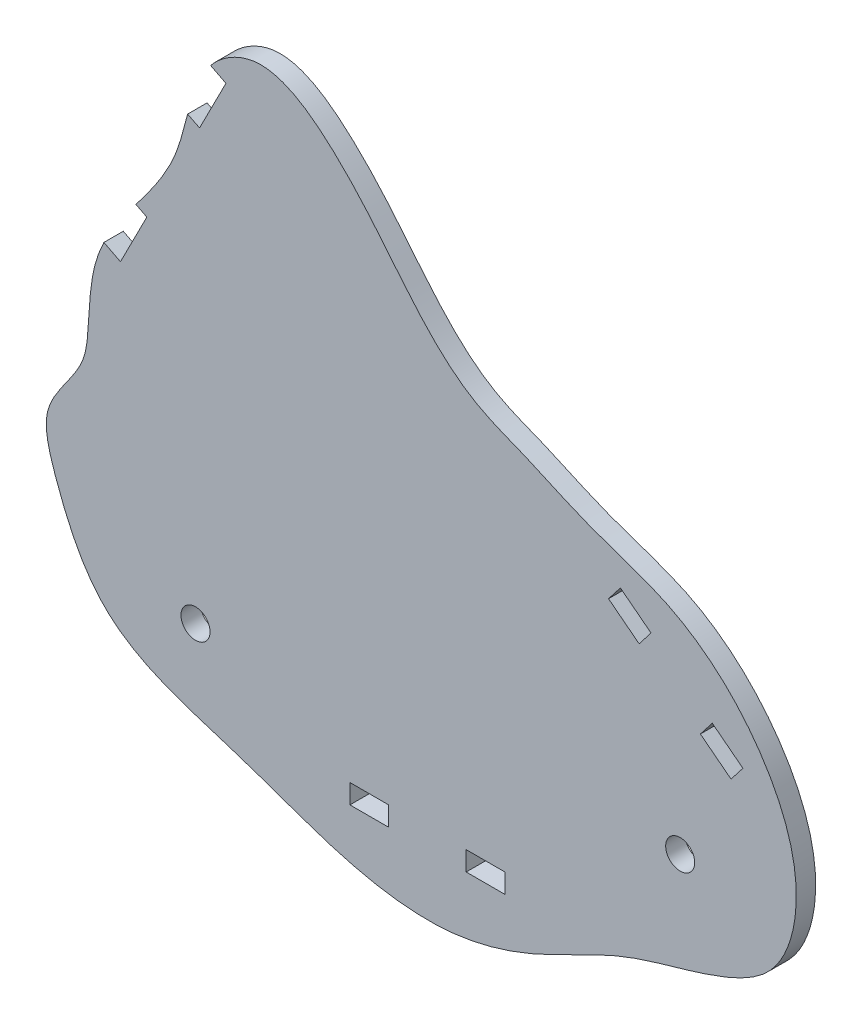
ISO-10303-21;
HEADER;
FILE_DESCRIPTION(('STEP AP214'),'2;1');
FILE_NAME('part.step','',(''),(''),'','','');
FILE_SCHEMA(('AUTOMOTIVE_DESIGN { 1 0 10303 214 1 1 1 1 }'));
ENDSEC;
DATA;
#1=APPLICATION_CONTEXT('core data for automotive mechanical design processes');
#2=APPLICATION_PROTOCOL_DEFINITION('international standard','automotive_design',2000,#1);
#3=PRODUCT_CONTEXT('',#1,'mechanical');
#4=PRODUCT('Part','Part','',(#3));
#5=PRODUCT_RELATED_PRODUCT_CATEGORY('part','',(#4));
#6=PRODUCT_DEFINITION_FORMATION('','',#4);
#7=PRODUCT_DEFINITION_CONTEXT('part definition',#1,'design');
#8=PRODUCT_DEFINITION('design','',#6,#7);
#9=PRODUCT_DEFINITION_SHAPE('','',#8);
#10=(LENGTH_UNIT() NAMED_UNIT(*) SI_UNIT(.MILLI.,.METRE.));
#11=(NAMED_UNIT(*) PLANE_ANGLE_UNIT() SI_UNIT($,.RADIAN.));
#12=(NAMED_UNIT(*) SI_UNIT($,.STERADIAN.) SOLID_ANGLE_UNIT());
#13=UNCERTAINTY_MEASURE_WITH_UNIT(LENGTH_MEASURE(1.E-05),#10,'distance_accuracy_value','');
#14=(GEOMETRIC_REPRESENTATION_CONTEXT(3) GLOBAL_UNCERTAINTY_ASSIGNED_CONTEXT((#13)) GLOBAL_UNIT_ASSIGNED_CONTEXT((#10,
#11,#12)) REPRESENTATION_CONTEXT('',''));
#15=CARTESIAN_POINT('',(0.,0.,0.));
#16=DIRECTION('',(0.,0.,1.));
#17=DIRECTION('',(1.,0.,0.));
#18=AXIS2_PLACEMENT_3D('',#15,#16,#17);
#19=CARTESIAN_POINT('',(103.338027454324,247.978514454164,5.82083802067196));
#20=DIRECTION('',(0.,0.,1.));
#21=DIRECTION('',(1.,0.,0.));
#22=AXIS2_PLACEMENT_3D('',#19,#20,#21);
#23=PLANE('',#22);
#24=CARTESIAN_POINT('',(120.991970876713,271.054419038319,5.82083802067196));
#25=DIRECTION('',(0.,0.,1.));
#26=DIRECTION('',(1.,0.,0.));
#27=AXIS2_PLACEMENT_3D('',#24,#25,#26);
#28=CIRCLE('',#27,2.38125000000001);
#29=CARTESIAN_POINT('',(123.373220876713,271.054419038319,5.82083802067196));
#30=VERTEX_POINT('',#29);
#31=EDGE_CURVE('E337',#30,#30,#28,.T.);
#32=ORIENTED_EDGE('',*,*,#31,.F.);
#33=EDGE_LOOP('',(#32));
#34=FACE_BOUND('',#33,.T.);
#35=CARTESIAN_POINT('',(41.5704047232676,264.101169083251,5.82083802067196));
#36=DIRECTION('',(0.,0.,1.));
#37=DIRECTION('',(1.,0.,0.));
#38=AXIS2_PLACEMENT_3D('',#35,#36,#37);
#39=CIRCLE('',#38,2.38125000000001);
#40=CARTESIAN_POINT('',(43.9516547232676,264.101169083251,5.82083802067196));
#41=VERTEX_POINT('',#40);
#42=EDGE_CURVE('E336',#41,#41,#39,.T.);
#43=ORIENTED_EDGE('',*,*,#42,.F.);
#44=EDGE_LOOP('',(#43));
#45=FACE_BOUND('',#44,.T.);
#46=DIRECTION('',(-0.790358439275779,0.612644707367618,0.));
#47=VECTOR('',#46,1.);
#48=CARTESIAN_POINT('',(131.452313127383,284.248089101087,5.82083802067196));
#49=LINE('',#48,#47);
#50=CARTESIAN_POINT('',(114.267499577497,297.56886173443,5.82083802067196));
#51=VERTEX_POINT('',#50);
#52=CARTESIAN_POINT('',(109.248723488096,301.459155626215,5.82083802067196));
#53=VERTEX_POINT('',#52);
#54=EDGE_CURVE('E325',#51,#53,#49,.T.);
#55=ORIENTED_EDGE('',*,*,#54,.T.);
#56=DIRECTION('',(0.612644707367617,0.79035843927578,0.));
#57=VECTOR('',#56,1.);
#58=CARTESIAN_POINT('',(81.1344378150372,265.189580979292,5.82083802067196));
#59=LINE('',#58,#57);
#60=CARTESIAN_POINT('',(111.193870433988,303.968543670915,5.82083802067196));
#61=VERTEX_POINT('',#60);
#62=EDGE_CURVE('E319',#53,#61,#59,.T.);
#63=ORIENTED_EDGE('',*,*,#62,.T.);
#64=DIRECTION('',(0.79035843927578,-0.612644707367617,0.));
#65=VECTOR('',#64,1.);
#66=CARTESIAN_POINT('',(133.397460073275,286.757477145787,5.82083802067196));
#67=LINE('',#66,#65);
#68=CARTESIAN_POINT('',(116.212646523389,300.078249779131,5.82083802067196));
#69=VERTEX_POINT('',#68);
#70=EDGE_CURVE('E332',#61,#69,#67,.T.);
#71=ORIENTED_EDGE('',*,*,#70,.T.);
#72=DIRECTION('',(-0.612644707367617,-0.79035843927578,0.));
#73=VECTOR('',#72,1.);
#74=CARTESIAN_POINT('',(86.1532139044383,261.299287087507,5.82083802067196));
#75=LINE('',#74,#73);
#76=EDGE_CURVE('E313',#69,#51,#75,.T.);
#77=ORIENTED_EDGE('',*,*,#76,.T.);
#78=EDGE_LOOP('',(#55,#63,#71,#77));
#79=FACE_BOUND('',#78,.T.);
#80=CARTESIAN_POINT('',(126.250198702192,292.297661995562,5.82083802067196));
#81=VERTEX_POINT('',#80);
#82=CARTESIAN_POINT('',(131.268974791593,288.407368103778,5.82083802067196));
#83=VERTEX_POINT('',#82);
#84=EDGE_CURVE('E329',#81,#83,#67,.T.);
#85=ORIENTED_EDGE('',*,*,#84,.T.);
#86=DIRECTION('',(-0.612644707367617,-0.79035843927578,0.));
#87=VECTOR('',#86,1.);
#88=CARTESIAN_POINT('',(101.209542172642,249.628405412154,5.82083802067196));
#89=LINE('',#88,#87);
#90=CARTESIAN_POINT('',(129.323827845701,285.897980059077,5.82083802067196));
#91=VERTEX_POINT('',#90);
#92=EDGE_CURVE('E322',#83,#91,#89,.T.);
#93=ORIENTED_EDGE('',*,*,#92,.T.);
#94=CARTESIAN_POINT('',(124.305051756299,289.788273950861,5.82083802067196));
#95=VERTEX_POINT('',#94);
#96=EDGE_CURVE('E328',#91,#95,#49,.T.);
#97=ORIENTED_EDGE('',*,*,#96,.T.);
#98=DIRECTION('',(0.612644707367617,0.79035843927578,0.));
#99=VECTOR('',#98,1.);
#100=CARTESIAN_POINT('',(96.1907660832408,253.518699303938,5.82083802067196));
#101=LINE('',#100,#99);
#102=EDGE_CURVE('E316',#95,#81,#101,.T.);
#103=ORIENTED_EDGE('',*,*,#102,.T.);
#104=EDGE_LOOP('',(#85,#93,#97,#103));
#105=FACE_BOUND('',#104,.T.);
#106=DIRECTION('',(-1.,0.,0.));
#107=VECTOR('',#106,1.);
#108=CARTESIAN_POINT('',(98.6231357055409,254.187588459737,5.82083802067194));
#109=LINE('',#108,#107);
#110=CARTESIAN_POINT('',(73.2231357055409,254.187588459737,5.82083802067193));
#111=VERTEX_POINT('',#110);
#112=CARTESIAN_POINT('',(66.8731357055409,254.187588459737,5.82083802067196));
#113=VERTEX_POINT('',#112);
#114=EDGE_CURVE('E274',#111,#113,#109,.T.);
#115=ORIENTED_EDGE('',*,*,#114,.F.);
#116=DIRECTION('',(0.,1.,0.));
#117=VECTOR('',#116,1.);
#118=CARTESIAN_POINT('',(73.2231357055409,251.012588459737,5.82083802067193));
#119=LINE('',#118,#117);
#120=CARTESIAN_POINT('',(73.2231357055409,251.012588459737,5.82083802067193));
#121=VERTEX_POINT('',#120);
#122=EDGE_CURVE('E258',#121,#111,#119,.T.);
#123=ORIENTED_EDGE('',*,*,#122,.F.);
#124=DIRECTION('',(-1.,0.,0.));
#125=VECTOR('',#124,1.);
#126=CARTESIAN_POINT('',(98.6231357055409,251.012588459737,5.82083802067194));
#127=LINE('',#126,#125);
#128=CARTESIAN_POINT('',(66.8731357055409,251.012588459737,5.82083802067193));
#129=VERTEX_POINT('',#128);
#130=EDGE_CURVE('E279',#121,#129,#127,.T.);
#131=ORIENTED_EDGE('',*,*,#130,.T.);
#132=DIRECTION('',(0.,1.,0.));
#133=VECTOR('',#132,1.);
#134=CARTESIAN_POINT('',(66.8731357055409,251.012588459737,5.82083802067193));
#135=LINE('',#134,#133);
#136=EDGE_CURVE('E247',#129,#113,#135,.T.);
#137=ORIENTED_EDGE('',*,*,#136,.T.);
#138=EDGE_LOOP('',(#115,#123,#131,#137));
#139=FACE_BOUND('',#138,.T.);
#140=CARTESIAN_POINT('',(92.2731357055409,254.187588459737,5.82083802067192));
#141=VERTEX_POINT('',#140);
#142=CARTESIAN_POINT('',(85.9231357055409,254.187588459737,5.82083802067196));
#143=VERTEX_POINT('',#142);
#144=EDGE_CURVE('E280',#141,#143,#109,.T.);
#145=ORIENTED_EDGE('',*,*,#144,.F.);
#146=DIRECTION('',(0.,1.,0.));
#147=VECTOR('',#146,1.);
#148=CARTESIAN_POINT('',(92.2731357055409,251.012588459737,5.82083802067192));
#149=LINE('',#148,#147);
#150=CARTESIAN_POINT('',(92.2731357055409,251.012588459737,5.82083802067192));
#151=VERTEX_POINT('',#150);
#152=EDGE_CURVE('E270',#151,#141,#149,.T.);
#153=ORIENTED_EDGE('',*,*,#152,.F.);
#154=CARTESIAN_POINT('',(85.9231357055409,251.012588459737,5.82083802067192));
#155=VERTEX_POINT('',#154);
#156=EDGE_CURVE('E275',#151,#155,#127,.T.);
#157=ORIENTED_EDGE('',*,*,#156,.T.);
#158=DIRECTION('',(0.,1.,0.));
#159=VECTOR('',#158,1.);
#160=CARTESIAN_POINT('',(85.9231357055409,251.012588459737,5.82083802067192));
#161=LINE('',#160,#159);
#162=EDGE_CURVE('E262',#155,#143,#161,.T.);
#163=ORIENTED_EDGE('',*,*,#162,.T.);
#164=EDGE_LOOP('',(#145,#153,#157,#163));
#165=FACE_BOUND('',#164,.T.);
#166=CARTESIAN_POINT('',(44.9303903077308,345.506865275812,5.82083802067196));
#167=CARTESIAN_POINT('',(40.6711084173475,341.327883722852,5.82083802067196));
#168=CARTESIAN_POINT('',(40.2919359812953,325.251712553941,5.82083802067196));
#169=CARTESIAN_POINT('',(24.9258502690923,313.188257892783,5.82083802067196));
#170=CARTESIAN_POINT('',(24.1062499432233,299.507858296953,5.82083802067196));
#171=CARTESIAN_POINT('',(23.5830066134999,290.209737372046,5.82083802067196));
#172=CARTESIAN_POINT('',(15.4264165113789,283.500816803777,5.82083802067196));
#173=CARTESIAN_POINT('',(19.4529216277424,270.365979151971,5.82083802067196));
#174=CARTESIAN_POINT('',(26.7356866804468,254.643572718222,5.82083802067196));
#175=CARTESIAN_POINT('',(47.8425296944439,249.740851056831,5.82083802067196));
#176=CARTESIAN_POINT('',(65.583031256316,242.431012929984,5.82083802067196));
#177=CARTESIAN_POINT('',(81.9564239812176,240.040251860317,5.82083802067196));
#178=CARTESIAN_POINT('',(97.5602155054142,244.364395153081,5.82083802067196));
#179=CARTESIAN_POINT('',(111.218791348648,252.769329920677,5.82083802067196));
#180=CARTESIAN_POINT('',(125.361956769308,255.645130443772,5.82083802067196));
#181=CARTESIAN_POINT('',(137.473722444029,261.473574450217,5.82083802067196));
#182=CARTESIAN_POINT('',(141.882392455883,276.221045545243,5.82083802067196));
#183=CARTESIAN_POINT('',(135.23234807106,293.098374145061,5.82083802067196));
#184=CARTESIAN_POINT('',(121.34066322969,305.84029446512,5.82083802067196));
#185=CARTESIAN_POINT('',(106.543948708746,309.622178132592,5.82083802067196));
#186=CARTESIAN_POINT('',(96.3847770341084,314.725208871395,5.82083802067196));
#187=CARTESIAN_POINT('',(83.8802855328658,319.086355358504,5.82083802067196));
#188=CARTESIAN_POINT('',(74.6914474485141,330.743152709568,5.82083802067196));
#189=CARTESIAN_POINT('',(64.8982793428132,342.47929844675,5.82083802067196));
#190=CARTESIAN_POINT('',(53.772604759642,351.050369233134,5.82083802067196));
#191=CARTESIAN_POINT('',(46.5700631461446,347.115625325268,5.82083802067196));
#192=CARTESIAN_POINT('',(44.9303903077308,345.506865275812,5.82083802067196));
#193=B_SPLINE_CURVE_WITH_KNOTS('',3,(#166,#167,#168,#169,#170,#171,#172,#173,#174,#175,#176,
#177,#178,#179,#180,#181,#182,#183,#184,#185,#186,#187,#188,#189,#190,#191,#192),.UNSPECIFIED.,
.T.,.F.,(4,1,1,1,1,1,1,1,1,1,1,1,1,1,1,1,1,1,1,1,1,1,1,1,4),(0.,0.0506703431487012,
0.120673769339057,0.148903991299556,0.164165852918775,0.198706745657619,0.223618805050156,
0.271958724436943,0.340540865221254,0.391818427760933,0.438500031110191,0.47715029360376,
0.52717793673782,0.572977176706086,0.600307039409929,0.63604026669744,0.690679968655316,
0.746912916373139,0.789386341209104,0.818681816571112,0.843719062980079,0.90065923217091,
0.937482649178856,0.980493710556792,1.),.UNSPECIFIED.);
#194=CARTESIAN_POINT('',(40.280522826522,335.754927274274,5.82083802067199));
#195=VERTEX_POINT('',#194);
#196=CARTESIAN_POINT('',(31.811572457011,318.689846008239,5.82083802067199));
#197=VERTEX_POINT('',#196);
#198=EDGE_CURVE('E350',#195,#197,#193,.T.);
#199=ORIENTED_EDGE('',*,*,#198,.T.);
#200=DIRECTION('',(-0.891186111500207,0.453637867322758,0.));
#201=VECTOR('',#200,1.);
#202=CARTESIAN_POINT('',(33.5896172491767,317.784773053091,5.82083802067199));
#203=LINE('',#202,#201);
#204=CARTESIAN_POINT('',(33.5896172491767,317.784773053091,5.82083802067199));
#205=VERTEX_POINT('',#204);
#206=EDGE_CURVE('E220',#205,#197,#203,.T.);
#207=ORIENTED_EDGE('',*,*,#206,.F.);
#208=DIRECTION('',(0.453637867322758,0.891186111500207,0.));
#209=VECTOR('',#208,1.);
#210=CARTESIAN_POINT('',(37.910517935426,326.27332076513,5.82083802067199));
#211=LINE('',#210,#209);
#212=CARTESIAN_POINT('',(29.2687165629274,309.296225341051,5.82083802067199));
#213=VERTEX_POINT('',#212);
#214=EDGE_CURVE('E226',#213,#205,#211,.T.);
#215=ORIENTED_EDGE('',*,*,#214,.F.);
#216=DIRECTION('',(-0.891186111500207,0.453637867322758,0.));
#217=VECTOR('',#216,1.);
#218=CARTESIAN_POINT('',(29.2687165629274,309.296225341051,5.82083802067199));
#219=LINE('',#218,#217);
#220=CARTESIAN_POINT('',(26.554525192939,310.677822258574,5.82083802067199));
#221=VERTEX_POINT('',#220);
#222=EDGE_CURVE('E234',#213,#221,#219,.T.);
#223=ORIENTED_EDGE('',*,*,#222,.T.);
#224=CARTESIAN_POINT('',(44.0415976478505,344.528441513698,5.82083802067196));
#225=VERTEX_POINT('',#224);
#226=EDGE_CURVE('E345',#221,#225,#193,.T.);
#227=ORIENTED_EDGE('',*,*,#226,.T.);
#228=DIRECTION('',(-0.891186111500207,0.453637867322758,0.));
#229=VECTOR('',#228,1.);
#230=CARTESIAN_POINT('',(46.5523193079245,343.250416189209,5.82083802067198));
#231=LINE('',#230,#229);
#232=CARTESIAN_POINT('',(46.5523193079245,343.250416189209,5.82083802067198));
#233=VERTEX_POINT('',#232);
#234=EDGE_CURVE('E61',#233,#225,#231,.T.);
#235=ORIENTED_EDGE('',*,*,#234,.F.);
#236=DIRECTION('',(0.453637867322758,0.891186111500207,0.));
#237=VECTOR('',#236,1.);
#238=CARTESIAN_POINT('',(37.910517935426,326.27332076513,5.82083802067199));
#239=LINE('',#238,#237);
#240=CARTESIAN_POINT('',(42.2314186216752,334.76186847717,5.82083802067199));
#241=VERTEX_POINT('',#240);
#242=EDGE_CURVE('E205',#241,#233,#239,.T.);
#243=ORIENTED_EDGE('',*,*,#242,.F.);
#244=DIRECTION('',(-0.891186111500207,0.453637867322758,0.));
#245=VECTOR('',#244,1.);
#246=CARTESIAN_POINT('',(42.2314186216752,334.76186847717,5.82083802067199));
#247=LINE('',#246,#245);
#248=EDGE_CURVE('E212',#241,#195,#247,.T.);
#249=ORIENTED_EDGE('',*,*,#248,.T.);
#250=EDGE_LOOP('',(#199,#207,#215,#223,#227,#235,#243,#249));
#251=FACE_BOUND('',#250,.T.);
#252=ADVANCED_FACE('F37',(#34,#45,#79,#105,#139,#165,#251),#23,.T.);
#253=CARTESIAN_POINT('',(103.338027454324,247.978514454164,2.64583802067196));
#254=DIRECTION('',(0.,0.,1.));
#255=DIRECTION('',(1.,0.,0.));
#256=AXIS2_PLACEMENT_3D('',#253,#254,#255);
#257=PLANE('',#256);
#258=DIRECTION('',(0.,-1.,0.));
#259=VECTOR('',#258,1.);
#260=CARTESIAN_POINT('',(92.2731357055409,247.978514454164,2.64583802067196));
#261=LINE('',#260,#259);
#262=CARTESIAN_POINT('',(92.2731357055409,254.187588459737,2.64583802067196));
#263=VERTEX_POINT('',#262);
#264=CARTESIAN_POINT('',(92.2731357055409,251.012588459737,2.64583802067196));
#265=VERTEX_POINT('',#264);
#266=EDGE_CURVE('E381',#263,#265,#261,.T.);
#267=ORIENTED_EDGE('',*,*,#266,.F.);
#268=DIRECTION('',(1.,0.,0.));
#269=VECTOR('',#268,1.);
#270=CARTESIAN_POINT('',(103.338027454324,254.187588459737,2.64583802067196));
#271=LINE('',#270,#269);
#272=CARTESIAN_POINT('',(85.9231357055409,254.187588459737,2.64583802067196));
#273=VERTEX_POINT('',#272);
#274=EDGE_CURVE('E373',#273,#263,#271,.T.);
#275=ORIENTED_EDGE('',*,*,#274,.F.);
#276=DIRECTION('',(0.,1.,0.));
#277=VECTOR('',#276,1.);
#278=CARTESIAN_POINT('',(85.9231357055409,247.978514454164,2.64583802067196));
#279=LINE('',#278,#277);
#280=CARTESIAN_POINT('',(85.9231357055409,251.012588459737,2.64583802067196));
#281=VERTEX_POINT('',#280);
#282=EDGE_CURVE('E379',#281,#273,#279,.T.);
#283=ORIENTED_EDGE('',*,*,#282,.F.);
#284=DIRECTION('',(1.,0.,0.));
#285=VECTOR('',#284,1.);
#286=CARTESIAN_POINT('',(103.338027454324,251.012588459737,2.64583802067196));
#287=LINE('',#286,#285);
#288=EDGE_CURVE('E377',#281,#265,#287,.T.);
#289=ORIENTED_EDGE('',*,*,#288,.T.);
#290=EDGE_LOOP('',(#267,#275,#283,#289));
#291=FACE_BOUND('',#290,.T.);
#292=CARTESIAN_POINT('',(120.991970876713,271.054419038319,2.64583802067196));
#293=DIRECTION('',(0.,0.,1.));
#294=DIRECTION('',(1.,0.,0.));
#295=AXIS2_PLACEMENT_3D('',#292,#293,#294);
#296=CIRCLE('',#295,2.38125000000001);
#297=CARTESIAN_POINT('',(123.373220876713,271.054419038319,2.64583802067196));
#298=VERTEX_POINT('',#297);
#299=EDGE_CURVE('E333',#298,#298,#296,.T.);
#300=ORIENTED_EDGE('',*,*,#299,.T.);
#301=EDGE_LOOP('',(#300));
#302=FACE_BOUND('',#301,.T.);
#303=CARTESIAN_POINT('',(41.5704047232676,264.101169083251,2.64583802067196));
#304=DIRECTION('',(0.,0.,1.));
#305=DIRECTION('',(1.,0.,0.));
#306=AXIS2_PLACEMENT_3D('',#303,#304,#305);
#307=CIRCLE('',#306,2.38125000000001);
#308=CARTESIAN_POINT('',(43.9516547232676,264.101169083251,2.64583802067196));
#309=VERTEX_POINT('',#308);
#310=EDGE_CURVE('E340',#309,#309,#307,.T.);
#311=ORIENTED_EDGE('',*,*,#310,.T.);
#312=EDGE_LOOP('',(#311));
#313=FACE_BOUND('',#312,.T.);
#314=DIRECTION('',(0.79035843927578,-0.612644707367617,0.));
#315=VECTOR('',#314,1.);
#316=CARTESIAN_POINT('',(133.397460073275,286.757477145787,2.64583802067196));
#317=LINE('',#316,#315);
#318=CARTESIAN_POINT('',(126.250198702192,292.297661995562,2.64583802067197));
#319=VERTEX_POINT('',#318);
#320=CARTESIAN_POINT('',(131.268974791593,288.407368103778,2.64583802067197));
#321=VERTEX_POINT('',#320);
#322=EDGE_CURVE('E366',#319,#321,#317,.T.);
#323=ORIENTED_EDGE('',*,*,#322,.F.);
#324=DIRECTION('',(0.612644707367617,0.79035843927578,0.));
#325=VECTOR('',#324,1.);
#326=CARTESIAN_POINT('',(113.002761856004,275.207457209259,2.64583802067197));
#327=LINE('',#326,#325);
#328=CARTESIAN_POINT('',(124.305051756299,289.788273950861,2.64583802067196));
#329=VERTEX_POINT('',#328);
#330=EDGE_CURVE('E286',#329,#319,#327,.T.);
#331=ORIENTED_EDGE('',*,*,#330,.F.);
#332=DIRECTION('',(-0.790358439275779,0.612644707367618,0.));
#333=VECTOR('',#332,1.);
#334=CARTESIAN_POINT('',(131.452313127383,284.248089101087,2.64583802067196));
#335=LINE('',#334,#333);
#336=CARTESIAN_POINT('',(129.323827845701,285.897980059077,2.64583802067197));
#337=VERTEX_POINT('',#336);
#338=EDGE_CURVE('E365',#337,#329,#335,.T.);
#339=ORIENTED_EDGE('',*,*,#338,.F.);
#340=DIRECTION('',(0.612644707367617,0.79035843927578,0.));
#341=VECTOR('',#340,1.);
#342=CARTESIAN_POINT('',(118.021537945406,271.317163317475,2.64583802067197));
#343=LINE('',#342,#341);
#344=EDGE_CURVE('E307',#337,#321,#343,.T.);
#345=ORIENTED_EDGE('',*,*,#344,.T.);
#346=EDGE_LOOP('',(#323,#331,#339,#345));
#347=FACE_BOUND('',#346,.T.);
#348=CARTESIAN_POINT('',(111.193870433988,303.968543670915,2.64583802067197));
#349=VERTEX_POINT('',#348);
#350=CARTESIAN_POINT('',(116.212646523389,300.078249779131,2.64583802067196));
#351=VERTEX_POINT('',#350);
#352=EDGE_CURVE('E364',#349,#351,#317,.T.);
#353=ORIENTED_EDGE('',*,*,#352,.F.);
#354=DIRECTION('',(0.612644707367617,0.79035843927578,0.));
#355=VECTOR('',#354,1.);
#356=CARTESIAN_POINT('',(97.9464335878008,286.878338884613,2.64583802067197));
#357=LINE('',#356,#355);
#358=CARTESIAN_POINT('',(109.248723488096,301.459155626215,2.64583802067197));
#359=VERTEX_POINT('',#358);
#360=EDGE_CURVE('E298',#359,#349,#357,.T.);
#361=ORIENTED_EDGE('',*,*,#360,.F.);
#362=CARTESIAN_POINT('',(114.267499577497,297.56886173443,2.64583802067197));
#363=VERTEX_POINT('',#362);
#364=EDGE_CURVE('E359',#363,#359,#335,.T.);
#365=ORIENTED_EDGE('',*,*,#364,.F.);
#366=DIRECTION('',(0.612644707367617,0.79035843927578,0.));
#367=VECTOR('',#366,1.);
#368=CARTESIAN_POINT('',(102.965209677202,282.988044992828,2.64583802067197));
#369=LINE('',#368,#367);
#370=EDGE_CURVE('E287',#363,#351,#369,.T.);
#371=ORIENTED_EDGE('',*,*,#370,.T.);
#372=EDGE_LOOP('',(#353,#361,#365,#371));
#373=FACE_BOUND('',#372,.T.);
#374=DIRECTION('',(0.,-1.,0.));
#375=VECTOR('',#374,1.);
#376=CARTESIAN_POINT('',(73.2231357055409,247.978514454164,2.64583802067196));
#377=LINE('',#376,#375);
#378=CARTESIAN_POINT('',(73.2231357055409,254.187588459737,2.64583802067196));
#379=VERTEX_POINT('',#378);
#380=CARTESIAN_POINT('',(73.2231357055409,251.012588459737,2.64583802067196));
#381=VERTEX_POINT('',#380);
#382=EDGE_CURVE('E376',#379,#381,#377,.T.);
#383=ORIENTED_EDGE('',*,*,#382,.F.);
#384=CARTESIAN_POINT('',(66.8731357055409,254.187588459737,2.64583802067196));
#385=VERTEX_POINT('',#384);
#386=EDGE_CURVE('E370',#385,#379,#271,.T.);
#387=ORIENTED_EDGE('',*,*,#386,.F.);
#388=DIRECTION('',(0.,1.,0.));
#389=VECTOR('',#388,1.);
#390=CARTESIAN_POINT('',(66.8731357055409,247.978514454164,2.64583802067196));
#391=LINE('',#390,#389);
#392=CARTESIAN_POINT('',(66.8731357055409,251.012588459737,2.64583802067196));
#393=VERTEX_POINT('',#392);
#394=EDGE_CURVE('E368',#393,#385,#391,.T.);
#395=ORIENTED_EDGE('',*,*,#394,.F.);
#396=EDGE_CURVE('E372',#393,#381,#287,.T.);
#397=ORIENTED_EDGE('',*,*,#396,.T.);
#398=EDGE_LOOP('',(#383,#387,#395,#397));
#399=FACE_BOUND('',#398,.T.);
#400=DIRECTION('',(0.891186111500207,-0.453637867322758,0.));
#401=VECTOR('',#400,1.);
#402=CARTESIAN_POINT('',(117.205668152848,275.221938515601,2.64583802067196));
#403=LINE('',#402,#401);
#404=CARTESIAN_POINT('',(31.8115724582953,318.689846007585,2.64583802067197));
#405=VERTEX_POINT('',#404);
#406=CARTESIAN_POINT('',(33.5896172491767,317.784773053091,2.64583802067197));
#407=VERTEX_POINT('',#406);
#408=EDGE_CURVE('E240',#405,#407,#403,.T.);
#409=ORIENTED_EDGE('',*,*,#408,.F.);
#410=CARTESIAN_POINT('',(44.9303903077308,345.506865275812,2.64583802067197));
#411=CARTESIAN_POINT('',(40.6711084173475,341.327883722852,2.64583802067197));
#412=CARTESIAN_POINT('',(40.2919359812953,325.251712553941,2.64583802067196));
#413=CARTESIAN_POINT('',(24.9258502690923,313.188257892783,2.64583802067196));
#414=CARTESIAN_POINT('',(24.1062499432233,299.507858296953,2.64583802067196));
#415=CARTESIAN_POINT('',(23.5830066134999,290.209737372046,2.64583802067196));
#416=CARTESIAN_POINT('',(15.4264165113789,283.500816803777,2.64583802067196));
#417=CARTESIAN_POINT('',(19.4529216277424,270.365979151971,2.64583802067196));
#418=CARTESIAN_POINT('',(26.7356866804468,254.643572718222,2.64583802067196));
#419=CARTESIAN_POINT('',(47.8425296944439,249.740851056831,2.64583802067196));
#420=CARTESIAN_POINT('',(65.583031256316,242.431012929984,2.64583802067196));
#421=CARTESIAN_POINT('',(81.9564239812176,240.040251860317,2.64583802067196));
#422=CARTESIAN_POINT('',(97.5602155054142,244.364395153081,2.64583802067196));
#423=CARTESIAN_POINT('',(111.218791348648,252.769329920677,2.64583802067196));
#424=CARTESIAN_POINT('',(125.361956769308,255.645130443772,2.64583802067196));
#425=CARTESIAN_POINT('',(137.473722444029,261.473574450217,2.64583802067196));
#426=CARTESIAN_POINT('',(141.882392455883,276.221045545243,2.64583802067196));
#427=CARTESIAN_POINT('',(135.23234807106,293.098374145061,2.64583802067196));
#428=CARTESIAN_POINT('',(121.34066322969,305.84029446512,2.64583802067196));
#429=CARTESIAN_POINT('',(106.543948708746,309.622178132592,2.64583802067196));
#430=CARTESIAN_POINT('',(96.3847770341084,314.725208871395,2.64583802067196));
#431=CARTESIAN_POINT('',(83.8802855328658,319.086355358504,2.64583802067196));
#432=CARTESIAN_POINT('',(74.6914474485141,330.743152709568,2.64583802067196));
#433=CARTESIAN_POINT('',(64.8982793428132,342.47929844675,2.64583802067196));
#434=CARTESIAN_POINT('',(53.772604759642,351.050369233134,2.64583802067196));
#435=CARTESIAN_POINT('',(46.5700631461446,347.115625325268,2.64583802067196));
#436=CARTESIAN_POINT('',(44.9303903077308,345.506865275812,2.64583802067197));
#437=B_SPLINE_CURVE_WITH_KNOTS('',3,(#410,#411,#412,#413,#414,#415,#416,#417,#418,#419,#420,
#421,#422,#423,#424,#425,#426,#427,#428,#429,#430,#431,#432,#433,#434,#435,#436),.UNSPECIFIED.,
.T.,.F.,(4,1,1,1,1,1,1,1,1,1,1,1,1,1,1,1,1,1,1,1,1,1,1,1,4),(0.,0.0506703431487012,
0.120673769339057,0.148903991299556,0.164165852918775,0.198706745657619,0.223618805050156,
0.271958724436943,0.340540865221254,0.391818427760933,0.438500031110191,0.47715029360376,
0.52717793673782,0.572977176706086,0.600307039409929,0.63604026669744,0.690679968655316,
0.746912916373139,0.789386341209104,0.818681816571112,0.843719062980079,0.90065923217091,
0.937482649178856,0.980493710556792,1.),.UNSPECIFIED.);
#438=CARTESIAN_POINT('',(40.280522826522,335.754927274274,2.64583802067197));
#439=VERTEX_POINT('',#438);
#440=EDGE_CURVE('E351',#439,#405,#437,.T.);
#441=ORIENTED_EDGE('',*,*,#440,.F.);
#442=DIRECTION('',(0.891186111500207,-0.453637867322758,0.));
#443=VECTOR('',#442,1.);
#444=CARTESIAN_POINT('',(125.847469525347,292.19903393968,2.64583802067196));
#445=LINE('',#444,#443);
#446=CARTESIAN_POINT('',(42.2314186216752,334.76186847717,2.64583802067197));
#447=VERTEX_POINT('',#446);
#448=EDGE_CURVE('E242',#439,#447,#445,.T.);
#449=ORIENTED_EDGE('',*,*,#448,.T.);
#450=DIRECTION('',(0.453637867322758,0.891186111500207,0.));
#451=VECTOR('',#450,1.);
#452=CARTESIAN_POINT('',(19.7219765506526,290.541348991654,2.64583802067196));
#453=LINE('',#452,#451);
#454=CARTESIAN_POINT('',(46.5523193079245,343.250416189209,2.64583802067197));
#455=VERTEX_POINT('',#454);
#456=EDGE_CURVE('E42',#447,#455,#453,.T.);
#457=ORIENTED_EDGE('',*,*,#456,.T.);
#458=DIRECTION('',(0.891186111500207,-0.453637867322758,0.));
#459=VECTOR('',#458,1.);
#460=CARTESIAN_POINT('',(130.168370211596,300.687581651719,2.64583802067196));
#461=LINE('',#460,#459);
#462=CARTESIAN_POINT('',(44.0415976478422,344.528441513688,2.64583802067197));
#463=VERTEX_POINT('',#462);
#464=EDGE_CURVE('E219',#463,#455,#461,.T.);
#465=ORIENTED_EDGE('',*,*,#464,.F.);
#466=CARTESIAN_POINT('',(26.554525192939,310.677822258574,2.64583802067196));
#467=VERTEX_POINT('',#466);
#468=EDGE_CURVE('E343',#467,#463,#437,.T.);
#469=ORIENTED_EDGE('',*,*,#468,.F.);
#470=DIRECTION('',(-0.891186111500207,0.453637867322758,0.));
#471=VECTOR('',#470,1.);
#472=CARTESIAN_POINT('',(112.884767466599,266.733390803561,2.64583802067196));
#473=LINE('',#472,#471);
#474=CARTESIAN_POINT('',(29.2687165629274,309.296225341051,2.64583802067197));
#475=VERTEX_POINT('',#474);
#476=EDGE_CURVE('E53',#475,#467,#473,.T.);
#477=ORIENTED_EDGE('',*,*,#476,.F.);
#478=EDGE_CURVE('E11',#475,#407,#453,.T.);
#479=ORIENTED_EDGE('',*,*,#478,.T.);
#480=EDGE_LOOP('',(#409,#441,#449,#457,#465,#469,#477,#479));
#481=FACE_BOUND('',#480,.T.);
#482=ADVANCED_FACE('F394',(#291,#302,#313,#347,#373,#399,#481),#257,.F.);
#483=DIRECTION('',(0.,0.,-1.));
#484=VECTOR('',#483,1.);
#485=SURFACE_OF_LINEAR_EXTRUSION('',#193,#484);
#486=ORIENTED_EDGE('',*,*,#198,.F.);
#487=DIRECTION('',(0.,0.,-1.));
#488=VECTOR('',#487,1.);
#489=CARTESIAN_POINT('',(40.280522826522,335.754927274274,5.82083802067196));
#490=LINE('',#489,#488);
#491=EDGE_CURVE('E215',#195,#439,#490,.T.);
#492=ORIENTED_EDGE('',*,*,#491,.T.);
#493=ORIENTED_EDGE('',*,*,#440,.T.);
#494=DIRECTION('',(0.,0.,-1.));
#495=VECTOR('',#494,1.);
#496=CARTESIAN_POINT('',(31.8115724582953,318.689846007585,5.82083802067196));
#497=LINE('',#496,#495);
#498=EDGE_CURVE('E387',#197,#405,#497,.T.);
#499=ORIENTED_EDGE('',*,*,#498,.F.);
#500=EDGE_LOOP('',(#486,#492,#493,#499));
#501=FACE_BOUND('',#500,.T.);
#502=ADVANCED_FACE('F39',(#501),#485,.F.);
#503=DIRECTION('',(0.,0.,-1.));
#504=VECTOR('',#503,1.);
#505=CARTESIAN_POINT('',(26.554525192939,310.677822258574,5.82083802067196));
#506=LINE('',#505,#504);
#507=EDGE_CURVE('E385',#467,#221,#506,.F.);
#508=ORIENTED_EDGE('',*,*,#507,.F.);
#509=ORIENTED_EDGE('',*,*,#468,.T.);
#510=DIRECTION('',(0.,0.,-1.));
#511=VECTOR('',#510,1.);
#512=CARTESIAN_POINT('',(44.0415976478422,344.528441513688,5.82083802067196));
#513=LINE('',#512,#511);
#514=EDGE_CURVE('E383',#225,#463,#513,.T.);
#515=ORIENTED_EDGE('',*,*,#514,.F.);
#516=ORIENTED_EDGE('',*,*,#226,.F.);
#517=EDGE_LOOP('',(#508,#509,#515,#516));
#518=FACE_BOUND('',#517,.T.);
#519=ADVANCED_FACE('F407',(#518),#485,.F.);
#520=CARTESIAN_POINT('',(41.5704047232676,264.101169083251,2.64583802067196));
#521=DIRECTION('',(0.,0.,1.));
#522=DIRECTION('',(1.,0.,0.));
#523=AXIS2_PLACEMENT_3D('',#520,#521,#522);
#524=CYLINDRICAL_SURFACE('',#523,2.38125000000001);
#525=ORIENTED_EDGE('',*,*,#310,.F.);
#526=EDGE_LOOP('',(#525));
#527=FACE_BOUND('',#526,.T.);
#528=ORIENTED_EDGE('',*,*,#42,.T.);
#529=EDGE_LOOP('',(#528));
#530=FACE_BOUND('',#529,.T.);
#531=ADVANCED_FACE('F434',(#527,#530),#524,.F.);
#532=CARTESIAN_POINT('',(120.991970876713,271.054419038319,2.64583802067196));
#533=DIRECTION('',(0.,0.,1.));
#534=DIRECTION('',(1.,0.,0.));
#535=AXIS2_PLACEMENT_3D('',#532,#533,#534);
#536=CYLINDRICAL_SURFACE('',#535,2.38125000000001);
#537=ORIENTED_EDGE('',*,*,#299,.F.);
#538=EDGE_LOOP('',(#537));
#539=FACE_BOUND('',#538,.T.);
#540=ORIENTED_EDGE('',*,*,#31,.T.);
#541=EDGE_LOOP('',(#540));
#542=FACE_BOUND('',#541,.T.);
#543=ADVANCED_FACE('F437',(#539,#542),#536,.F.);
#544=CARTESIAN_POINT('',(97.9464335878008,286.878338884613,8.99583802067205));
#545=DIRECTION('',(0.79035843927578,-0.612644707367617,0.));
#546=DIRECTION('',(-0.612644707367617,-0.79035843927578,0.));
#547=AXIS2_PLACEMENT_3D('',#544,#545,#546);
#548=PLANE('',#547);
#549=DIRECTION('',(0.,0.,-1.));
#550=VECTOR('',#549,1.);
#551=CARTESIAN_POINT('',(109.248723488096,301.459155626215,8.99583802067205));
#552=LINE('',#551,#550);
#553=EDGE_CURVE('E301',#53,#359,#552,.T.);
#554=ORIENTED_EDGE('',*,*,#553,.T.);
#555=ORIENTED_EDGE('',*,*,#360,.T.);
#556=DIRECTION('',(0.,0.,-1.));
#557=VECTOR('',#556,1.);
#558=CARTESIAN_POINT('',(111.193870433988,303.968543670915,8.99583802067205));
#559=LINE('',#558,#557);
#560=EDGE_CURVE('E296',#61,#349,#559,.T.);
#561=ORIENTED_EDGE('',*,*,#560,.F.);
#562=ORIENTED_EDGE('',*,*,#62,.F.);
#563=EDGE_LOOP('',(#554,#555,#561,#562));
#564=FACE_BOUND('',#563,.T.);
#565=ADVANCED_FACE('F441',(#564),#548,.T.);
#566=CARTESIAN_POINT('',(102.965209677202,282.988044992828,8.99583802067205));
#567=DIRECTION('',(-0.79035843927578,0.612644707367617,0.));
#568=DIRECTION('',(0.612644707367617,0.79035843927578,0.));
#569=AXIS2_PLACEMENT_3D('',#566,#567,#568);
#570=PLANE('',#569);
#571=DIRECTION('',(0.,0.,1.));
#572=VECTOR('',#571,1.);
#573=CARTESIAN_POINT('',(116.212646523389,300.078249779131,8.99583802067205));
#574=LINE('',#573,#572);
#575=EDGE_CURVE('E283',#351,#69,#574,.T.);
#576=ORIENTED_EDGE('',*,*,#575,.F.);
#577=ORIENTED_EDGE('',*,*,#370,.F.);
#578=DIRECTION('',(0.,0.,1.));
#579=VECTOR('',#578,1.);
#580=CARTESIAN_POINT('',(114.267499577497,297.56886173443,8.99583802067205));
#581=LINE('',#580,#579);
#582=EDGE_CURVE('E290',#363,#51,#581,.T.);
#583=ORIENTED_EDGE('',*,*,#582,.T.);
#584=ORIENTED_EDGE('',*,*,#76,.F.);
#585=EDGE_LOOP('',(#576,#577,#583,#584));
#586=FACE_BOUND('',#585,.T.);
#587=ADVANCED_FACE('F460',(#586),#570,.T.);
#588=CARTESIAN_POINT('',(104.229947398695,305.349449517999,8.99583802067205));
#589=DIRECTION('',(0.612644707367618,0.790358439275779,0.));
#590=DIRECTION('',(0.790358439275779,-0.612644707367618,0.));
#591=AXIS2_PLACEMENT_3D('',#588,#589,#590);
#592=PLANE('',#591);
#593=ORIENTED_EDGE('',*,*,#582,.F.);
#594=ORIENTED_EDGE('',*,*,#364,.T.);
#595=ORIENTED_EDGE('',*,*,#553,.F.);
#596=ORIENTED_EDGE('',*,*,#54,.F.);
#597=EDGE_LOOP('',(#593,#594,#595,#596));
#598=FACE_BOUND('',#597,.T.);
#599=ADVANCED_FACE('F447',(#598),#592,.T.);
#600=CARTESIAN_POINT('',(136.287750880994,284.517074211993,8.99583802067205));
#601=DIRECTION('',(-0.612644707367617,-0.79035843927578,0.));
#602=DIRECTION('',(-0.79035843927578,0.612644707367617,0.));
#603=AXIS2_PLACEMENT_3D('',#600,#601,#602);
#604=PLANE('',#603);
#605=ORIENTED_EDGE('',*,*,#560,.T.);
#606=ORIENTED_EDGE('',*,*,#352,.T.);
#607=ORIENTED_EDGE('',*,*,#575,.T.);
#608=ORIENTED_EDGE('',*,*,#70,.F.);
#609=EDGE_LOOP('',(#605,#606,#607,#608));
#610=FACE_BOUND('',#609,.T.);
#611=ADVANCED_FACE('F443',(#610),#604,.T.);
#612=DIRECTION('',(0.,0.,-1.));
#613=VECTOR('',#612,1.);
#614=CARTESIAN_POINT('',(126.250198702192,292.297661995562,8.99583802067205));
#615=LINE('',#614,#613);
#616=EDGE_CURVE('E278',#81,#319,#615,.T.);
#617=ORIENTED_EDGE('',*,*,#616,.T.);
#618=ORIENTED_EDGE('',*,*,#322,.T.);
#619=DIRECTION('',(0.,0.,1.));
#620=VECTOR('',#619,1.);
#621=CARTESIAN_POINT('',(131.268974791593,288.407368103778,8.99583802067205));
#622=LINE('',#621,#620);
#623=EDGE_CURVE('E304',#321,#83,#622,.T.);
#624=ORIENTED_EDGE('',*,*,#623,.T.);
#625=ORIENTED_EDGE('',*,*,#84,.F.);
#626=EDGE_LOOP('',(#617,#618,#624,#625));
#627=FACE_BOUND('',#626,.T.);
#628=ADVANCED_FACE('F446',(#627),#604,.T.);
#629=DIRECTION('',(0.,0.,1.));
#630=VECTOR('',#629,1.);
#631=CARTESIAN_POINT('',(129.323827845701,285.897980059077,8.99583802067205));
#632=LINE('',#631,#630);
#633=EDGE_CURVE('E310',#337,#91,#632,.T.);
#634=ORIENTED_EDGE('',*,*,#633,.F.);
#635=ORIENTED_EDGE('',*,*,#338,.T.);
#636=DIRECTION('',(0.,0.,-1.));
#637=VECTOR('',#636,1.);
#638=CARTESIAN_POINT('',(124.305051756299,289.788273950861,8.99583802067205));
#639=LINE('',#638,#637);
#640=EDGE_CURVE('E294',#95,#329,#639,.T.);
#641=ORIENTED_EDGE('',*,*,#640,.F.);
#642=ORIENTED_EDGE('',*,*,#96,.F.);
#643=EDGE_LOOP('',(#634,#635,#641,#642));
#644=FACE_BOUND('',#643,.T.);
#645=ADVANCED_FACE('F449',(#644),#592,.T.);
#646=CARTESIAN_POINT('',(118.021537945406,271.317163317475,8.99583802067205));
#647=DIRECTION('',(-0.79035843927578,0.612644707367617,0.));
#648=DIRECTION('',(0.612644707367617,0.79035843927578,0.));
#649=AXIS2_PLACEMENT_3D('',#646,#647,#648);
#650=PLANE('',#649);
#651=ORIENTED_EDGE('',*,*,#623,.F.);
#652=ORIENTED_EDGE('',*,*,#344,.F.);
#653=ORIENTED_EDGE('',*,*,#633,.T.);
#654=ORIENTED_EDGE('',*,*,#92,.F.);
#655=EDGE_LOOP('',(#651,#652,#653,#654));
#656=FACE_BOUND('',#655,.T.);
#657=ADVANCED_FACE('F452',(#656),#650,.T.);
#658=CARTESIAN_POINT('',(113.002761856004,275.207457209259,8.99583802067205));
#659=DIRECTION('',(0.79035843927578,-0.612644707367617,0.));
#660=DIRECTION('',(-0.612644707367617,-0.79035843927578,0.));
#661=AXIS2_PLACEMENT_3D('',#658,#659,#660);
#662=PLANE('',#661);
#663=ORIENTED_EDGE('',*,*,#640,.T.);
#664=ORIENTED_EDGE('',*,*,#330,.T.);
#665=ORIENTED_EDGE('',*,*,#616,.F.);
#666=ORIENTED_EDGE('',*,*,#102,.F.);
#667=EDGE_LOOP('',(#663,#664,#665,#666));
#668=FACE_BOUND('',#667,.T.);
#669=ADVANCED_FACE('F456',(#668),#662,.T.);
#670=CARTESIAN_POINT('',(73.2231357055409,251.012588459737,5.82083802067193));
#671=DIRECTION('',(-1.,0.,0.));
#672=DIRECTION('',(0.,0.,1.));
#673=AXIS2_PLACEMENT_3D('',#670,#671,#672);
#674=PLANE('',#673);
#675=ORIENTED_EDGE('',*,*,#382,.T.);
#676=DIRECTION('',(0.,0.,1.));
#677=VECTOR('',#676,1.);
#678=CARTESIAN_POINT('',(73.2231357055409,251.012588459737,5.82083802067193));
#679=LINE('',#678,#677);
#680=EDGE_CURVE('E255',#381,#121,#679,.T.);
#681=ORIENTED_EDGE('',*,*,#680,.T.);
#682=ORIENTED_EDGE('',*,*,#122,.T.);
#683=DIRECTION('',(0.,0.,1.));
#684=VECTOR('',#683,1.);
#685=CARTESIAN_POINT('',(73.2231357055409,254.187588459737,5.82083802067193));
#686=LINE('',#685,#684);
#687=EDGE_CURVE('E256',#379,#111,#686,.T.);
#688=ORIENTED_EDGE('',*,*,#687,.F.);
#689=EDGE_LOOP('',(#675,#681,#682,#688));
#690=FACE_BOUND('',#689,.T.);
#691=ADVANCED_FACE('F464',(#690),#674,.T.);
#692=CARTESIAN_POINT('',(66.8731357055409,251.012588459737,5.82083802067193));
#693=DIRECTION('',(1.,0.,0.));
#694=DIRECTION('',(0.,0.,-1.));
#695=AXIS2_PLACEMENT_3D('',#692,#693,#694);
#696=PLANE('',#695);
#697=ORIENTED_EDGE('',*,*,#394,.T.);
#698=DIRECTION('',(0.,0.,-1.));
#699=VECTOR('',#698,1.);
#700=CARTESIAN_POINT('',(66.8731357055409,254.187588459737,5.82083802067193));
#701=LINE('',#700,#699);
#702=EDGE_CURVE('E244',#113,#385,#701,.T.);
#703=ORIENTED_EDGE('',*,*,#702,.F.);
#704=ORIENTED_EDGE('',*,*,#136,.F.);
#705=DIRECTION('',(0.,0.,-1.));
#706=VECTOR('',#705,1.);
#707=CARTESIAN_POINT('',(66.8731357055409,251.012588459737,5.82083802067193));
#708=LINE('',#707,#706);
#709=EDGE_CURVE('E245',#129,#393,#708,.T.);
#710=ORIENTED_EDGE('',*,*,#709,.T.);
#711=EDGE_LOOP('',(#697,#703,#704,#710));
#712=FACE_BOUND('',#711,.T.);
#713=ADVANCED_FACE('F477',(#712),#696,.T.);
#714=CARTESIAN_POINT('',(98.6231357055409,254.187588459737,44.0529008083375));
#715=DIRECTION('',(0.,-1.,0.));
#716=DIRECTION('',(0.,0.,1.));
#717=AXIS2_PLACEMENT_3D('',#714,#715,#716);
#718=PLANE('',#717);
#719=ORIENTED_EDGE('',*,*,#386,.T.);
#720=ORIENTED_EDGE('',*,*,#687,.T.);
#721=ORIENTED_EDGE('',*,*,#114,.T.);
#722=ORIENTED_EDGE('',*,*,#702,.T.);
#723=EDGE_LOOP('',(#719,#720,#721,#722));
#724=FACE_BOUND('',#723,.T.);
#725=ADVANCED_FACE('F473',(#724),#718,.T.);
#726=CARTESIAN_POINT('',(98.6231357055409,251.012588459737,44.0529008083375));
#727=DIRECTION('',(0.,-1.,0.));
#728=DIRECTION('',(0.,0.,1.));
#729=AXIS2_PLACEMENT_3D('',#726,#727,#728);
#730=PLANE('',#729);
#731=ORIENTED_EDGE('',*,*,#709,.F.);
#732=ORIENTED_EDGE('',*,*,#130,.F.);
#733=ORIENTED_EDGE('',*,*,#680,.F.);
#734=ORIENTED_EDGE('',*,*,#396,.F.);
#735=EDGE_LOOP('',(#731,#732,#733,#734));
#736=FACE_BOUND('',#735,.T.);
#737=ADVANCED_FACE('F469',(#736),#730,.F.);
#738=DIRECTION('',(0.,0.,-1.));
#739=VECTOR('',#738,1.);
#740=CARTESIAN_POINT('',(85.9231357055409,251.012588459737,5.82083802067192));
#741=LINE('',#740,#739);
#742=EDGE_CURVE('E253',#155,#281,#741,.T.);
#743=ORIENTED_EDGE('',*,*,#742,.F.);
#744=ORIENTED_EDGE('',*,*,#156,.F.);
#745=DIRECTION('',(0.,0.,1.));
#746=VECTOR('',#745,1.);
#747=CARTESIAN_POINT('',(92.2731357055409,251.012588459737,5.82083802067192));
#748=LINE('',#747,#746);
#749=EDGE_CURVE('E268',#265,#151,#748,.T.);
#750=ORIENTED_EDGE('',*,*,#749,.F.);
#751=ORIENTED_EDGE('',*,*,#288,.F.);
#752=EDGE_LOOP('',(#743,#744,#750,#751));
#753=FACE_BOUND('',#752,.T.);
#754=ADVANCED_FACE('F472',(#753),#730,.F.);
#755=ORIENTED_EDGE('',*,*,#274,.T.);
#756=DIRECTION('',(0.,0.,1.));
#757=VECTOR('',#756,1.);
#758=CARTESIAN_POINT('',(92.2731357055409,254.187588459737,5.82083802067192));
#759=LINE('',#758,#757);
#760=EDGE_CURVE('E265',#263,#141,#759,.T.);
#761=ORIENTED_EDGE('',*,*,#760,.T.);
#762=ORIENTED_EDGE('',*,*,#144,.T.);
#763=DIRECTION('',(0.,0.,-1.));
#764=VECTOR('',#763,1.);
#765=CARTESIAN_POINT('',(85.9231357055409,254.187588459737,5.82083802067192));
#766=LINE('',#765,#764);
#767=EDGE_CURVE('E252',#143,#273,#766,.T.);
#768=ORIENTED_EDGE('',*,*,#767,.T.);
#769=EDGE_LOOP('',(#755,#761,#762,#768));
#770=FACE_BOUND('',#769,.T.);
#771=ADVANCED_FACE('F479',(#770),#718,.T.);
#772=CARTESIAN_POINT('',(92.2731357055409,251.012588459737,5.82083802067192));
#773=DIRECTION('',(-1.,0.,0.));
#774=DIRECTION('',(0.,0.,1.));
#775=AXIS2_PLACEMENT_3D('',#772,#773,#774);
#776=PLANE('',#775);
#777=ORIENTED_EDGE('',*,*,#266,.T.);
#778=ORIENTED_EDGE('',*,*,#749,.T.);
#779=ORIENTED_EDGE('',*,*,#152,.T.);
#780=ORIENTED_EDGE('',*,*,#760,.F.);
#781=EDGE_LOOP('',(#777,#778,#779,#780));
#782=FACE_BOUND('',#781,.T.);
#783=ADVANCED_FACE('F418',(#782),#776,.T.);
#784=CARTESIAN_POINT('',(85.9231357055409,251.012588459737,5.82083802067192));
#785=DIRECTION('',(1.,0.,0.));
#786=DIRECTION('',(0.,0.,-1.));
#787=AXIS2_PLACEMENT_3D('',#784,#785,#786);
#788=PLANE('',#787);
#789=ORIENTED_EDGE('',*,*,#282,.T.);
#790=ORIENTED_EDGE('',*,*,#767,.F.);
#791=ORIENTED_EDGE('',*,*,#162,.F.);
#792=ORIENTED_EDGE('',*,*,#742,.T.);
#793=EDGE_LOOP('',(#789,#790,#791,#792));
#794=FACE_BOUND('',#793,.T.);
#795=ADVANCED_FACE('F411',(#794),#788,.T.);
#796=CARTESIAN_POINT('',(46.5523193079245,343.250416189209,-10.054161979328));
#797=DIRECTION('',(-0.453637867322758,-0.891186111500207,0.));
#798=DIRECTION('',(-0.891186111500207,0.453637867322758,0.));
#799=AXIS2_PLACEMENT_3D('',#796,#797,#798);
#800=PLANE('',#799);
#801=ORIENTED_EDGE('',*,*,#464,.T.);
#802=DIRECTION('',(0.,0.,1.));
#803=VECTOR('',#802,1.);
#804=CARTESIAN_POINT('',(46.5523193079245,343.250416189209,-10.054161979328));
#805=LINE('',#804,#803);
#806=EDGE_CURVE('E231',#455,#233,#805,.T.);
#807=ORIENTED_EDGE('',*,*,#806,.T.);
#808=ORIENTED_EDGE('',*,*,#234,.T.);
#809=ORIENTED_EDGE('',*,*,#514,.T.);
#810=EDGE_LOOP('',(#801,#807,#808,#809));
#811=FACE_BOUND('',#810,.T.);
#812=ADVANCED_FACE('F409',(#811),#800,.T.);
#813=CARTESIAN_POINT('',(42.2314186216752,334.76186847717,-10.054161979328));
#814=DIRECTION('',(-0.453637867322758,-0.891186111500207,0.));
#815=DIRECTION('',(-0.891186111500207,0.453637867322758,0.));
#816=AXIS2_PLACEMENT_3D('',#813,#814,#815);
#817=PLANE('',#816);
#818=ORIENTED_EDGE('',*,*,#491,.F.);
#819=ORIENTED_EDGE('',*,*,#248,.F.);
#820=DIRECTION('',(0.,0.,1.));
#821=VECTOR('',#820,1.);
#822=CARTESIAN_POINT('',(42.2314186216752,334.76186847717,-10.054161979328));
#823=LINE('',#822,#821);
#824=EDGE_CURVE('E200',#447,#241,#823,.T.);
#825=ORIENTED_EDGE('',*,*,#824,.F.);
#826=ORIENTED_EDGE('',*,*,#448,.F.);
#827=EDGE_LOOP('',(#818,#819,#825,#826));
#828=FACE_BOUND('',#827,.T.);
#829=ADVANCED_FACE('F213',(#828),#817,.F.);
#830=CARTESIAN_POINT('',(37.910517935426,326.27332076513,-10.054161979328));
#831=DIRECTION('',(0.891186111500207,-0.453637867322758,0.));
#832=DIRECTION('',(0.,0.,-1.));
#833=AXIS2_PLACEMENT_3D('',#830,#831,#832);
#834=PLANE('',#833);
#835=ORIENTED_EDGE('',*,*,#824,.T.);
#836=ORIENTED_EDGE('',*,*,#242,.T.);
#837=ORIENTED_EDGE('',*,*,#806,.F.);
#838=ORIENTED_EDGE('',*,*,#456,.F.);
#839=EDGE_LOOP('',(#835,#836,#837,#838));
#840=FACE_BOUND('',#839,.T.);
#841=ADVANCED_FACE('F202',(#840),#834,.F.);
#842=DIRECTION('',(0.,0.,-1.));
#843=VECTOR('',#842,1.);
#844=CARTESIAN_POINT('',(29.2687165629274,309.296225341051,-10.054161979328));
#845=LINE('',#844,#843);
#846=EDGE_CURVE('E229',#213,#475,#845,.T.);
#847=ORIENTED_EDGE('',*,*,#846,.F.);
#848=ORIENTED_EDGE('',*,*,#214,.T.);
#849=DIRECTION('',(0.,0.,1.));
#850=VECTOR('',#849,1.);
#851=CARTESIAN_POINT('',(33.5896172491767,317.784773053091,-10.054161979328));
#852=LINE('',#851,#850);
#853=EDGE_CURVE('E209',#407,#205,#852,.T.);
#854=ORIENTED_EDGE('',*,*,#853,.F.);
#855=ORIENTED_EDGE('',*,*,#478,.F.);
#856=EDGE_LOOP('',(#847,#848,#854,#855));
#857=FACE_BOUND('',#856,.T.);
#858=ADVANCED_FACE('F404',(#857),#834,.F.);
#859=CARTESIAN_POINT('',(33.5896172491767,317.784773053091,-10.054161979328));
#860=DIRECTION('',(-0.453637867322758,-0.891186111500207,0.));
#861=DIRECTION('',(-0.891186111500207,0.453637867322758,0.));
#862=AXIS2_PLACEMENT_3D('',#859,#860,#861);
#863=PLANE('',#862);
#864=ORIENTED_EDGE('',*,*,#408,.T.);
#865=ORIENTED_EDGE('',*,*,#853,.T.);
#866=ORIENTED_EDGE('',*,*,#206,.T.);
#867=ORIENTED_EDGE('',*,*,#498,.T.);
#868=EDGE_LOOP('',(#864,#865,#866,#867));
#869=FACE_BOUND('',#868,.T.);
#870=ADVANCED_FACE('F400',(#869),#863,.T.);
#871=CARTESIAN_POINT('',(29.2687165629274,309.296225341051,-10.054161979328));
#872=DIRECTION('',(0.453637867322758,0.891186111500207,0.));
#873=DIRECTION('',(0.891186111500207,-0.453637867322758,0.));
#874=AXIS2_PLACEMENT_3D('',#871,#872,#873);
#875=PLANE('',#874);
#876=ORIENTED_EDGE('',*,*,#476,.T.);
#877=ORIENTED_EDGE('',*,*,#507,.T.);
#878=ORIENTED_EDGE('',*,*,#222,.F.);
#879=ORIENTED_EDGE('',*,*,#846,.T.);
#880=EDGE_LOOP('',(#876,#877,#878,#879));
#881=FACE_BOUND('',#880,.T.);
#882=ADVANCED_FACE('F405',(#881),#875,.T.);
#883=CLOSED_SHELL('',(#252,#482,#502,#519,#531,#543,#565,#587,#599,#611,#628,#645,#657,#669,
#691,#713,#725,#737,#754,#771,#783,#795,#812,#829,#841,#858,#870,#882));
#884=MANIFOLD_SOLID_BREP('B2',#883);
#885=ADVANCED_BREP_SHAPE_REPRESENTATION('',(#18,#884),#14);
#886=SHAPE_DEFINITION_REPRESENTATION(#9,#885);
ENDSEC;
END-ISO-10303-21;
